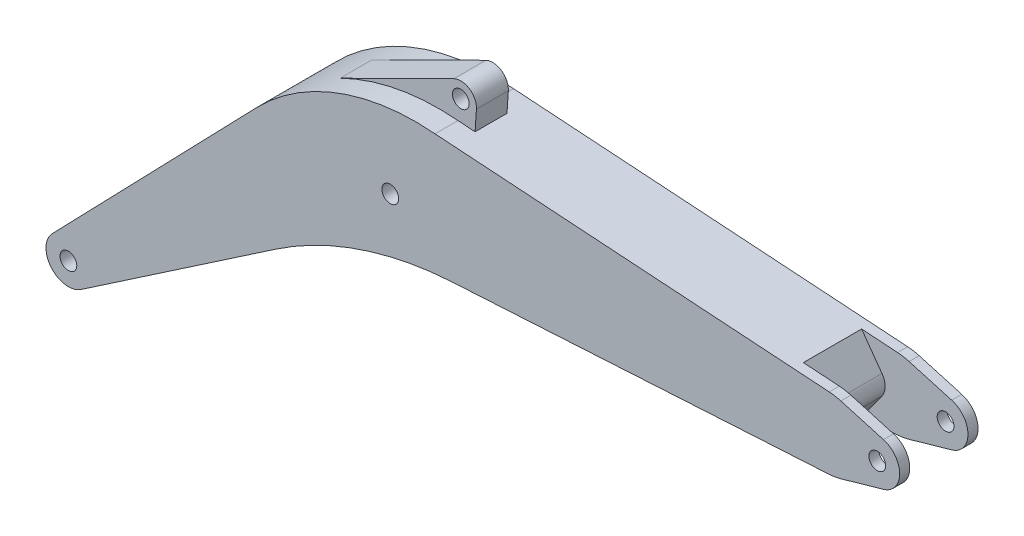
ISO-10303-21;
HEADER;
FILE_DESCRIPTION(('STEP AP214'),'2;1');
FILE_NAME('part.step','',(''),(''),'','','');
FILE_SCHEMA(('AUTOMOTIVE_DESIGN { 1 0 10303 214 1 1 1 1 }'));
ENDSEC;
DATA;
#1=APPLICATION_CONTEXT('core data for automotive mechanical design processes');
#2=APPLICATION_PROTOCOL_DEFINITION('international standard','automotive_design',2000,#1);
#3=PRODUCT_CONTEXT('',#1,'mechanical');
#4=PRODUCT('Part','Part','',(#3));
#5=PRODUCT_RELATED_PRODUCT_CATEGORY('part','',(#4));
#6=PRODUCT_DEFINITION_FORMATION('','',#4);
#7=PRODUCT_DEFINITION_CONTEXT('part definition',#1,'design');
#8=PRODUCT_DEFINITION('design','',#6,#7);
#9=PRODUCT_DEFINITION_SHAPE('','',#8);
#10=(LENGTH_UNIT() NAMED_UNIT(*) SI_UNIT(.MILLI.,.METRE.));
#11=(NAMED_UNIT(*) PLANE_ANGLE_UNIT() SI_UNIT($,.RADIAN.));
#12=(NAMED_UNIT(*) SI_UNIT($,.STERADIAN.) SOLID_ANGLE_UNIT());
#13=UNCERTAINTY_MEASURE_WITH_UNIT(LENGTH_MEASURE(1.E-05),#10,'distance_accuracy_value','');
#14=(GEOMETRIC_REPRESENTATION_CONTEXT(3) GLOBAL_UNCERTAINTY_ASSIGNED_CONTEXT((#13)) GLOBAL_UNIT_ASSIGNED_CONTEXT((#10,
#11,#12)) REPRESENTATION_CONTEXT('',''));
#15=CARTESIAN_POINT('',(0.,0.,0.));
#16=DIRECTION('',(0.,0.,1.));
#17=DIRECTION('',(1.,0.,0.));
#18=AXIS2_PLACEMENT_3D('',#15,#16,#17);
#19=CARTESIAN_POINT('',(279.256107712575,105.107215986189,-10.5002382098289));
#20=DIRECTION('',(0.,0.,1.));
#21=DIRECTION('',(1.,0.,0.));
#22=AXIS2_PLACEMENT_3D('',#19,#20,#21);
#23=CYLINDRICAL_SURFACE('',#22,6.);
#24=CARTESIAN_POINT('',(279.256107712575,105.107215986189,-7.80023820982889));
#25=DIRECTION('',(0.,0.,1.));
#26=DIRECTION('',(1.,0.,0.));
#27=AXIS2_PLACEMENT_3D('',#24,#25,#26);
#28=CIRCLE('',#27,6.00000000000002);
#29=CARTESIAN_POINT('',(280.904961768903,99.3382229803923,-7.80023820982889));
#30=VERTEX_POINT('',#29);
#31=CARTESIAN_POINT('',(280.904961768903,110.876208991986,-7.80023820982889));
#32=VERTEX_POINT('',#31);
#33=EDGE_CURVE('E438',#30,#32,#28,.T.);
#34=ORIENTED_EDGE('',*,*,#33,.F.);
#35=DIRECTION('',(0.,0.,1.));
#36=VECTOR('',#35,1.);
#37=CARTESIAN_POINT('',(280.904961768903,99.3382229803923,-10.5002382098289));
#38=LINE('',#37,#36);
#39=CARTESIAN_POINT('',(280.904961768903,99.3382229803923,-10.5002382098289));
#40=VERTEX_POINT('',#39);
#41=EDGE_CURVE('E282',#40,#30,#38,.T.);
#42=ORIENTED_EDGE('',*,*,#41,.F.);
#43=CARTESIAN_POINT('',(279.256107712575,105.107215986189,-10.5002382098289));
#44=DIRECTION('',(0.,0.,1.));
#45=DIRECTION('',(1.,0.,0.));
#46=AXIS2_PLACEMENT_3D('',#43,#44,#45);
#47=CIRCLE('',#46,6.);
#48=CARTESIAN_POINT('',(280.904961768903,110.876208991986,-10.5002382098289));
#49=VERTEX_POINT('',#48);
#50=EDGE_CURVE('E309',#49,#40,#47,.F.);
#51=ORIENTED_EDGE('',*,*,#50,.F.);
#52=DIRECTION('',(0.,0.,1.));
#53=VECTOR('',#52,1.);
#54=CARTESIAN_POINT('',(280.904961768903,110.876208991986,-10.5002382098289));
#55=LINE('',#54,#53);
#56=EDGE_CURVE('E263',#49,#32,#55,.T.);
#57=ORIENTED_EDGE('',*,*,#56,.T.);
#58=EDGE_LOOP('',(#34,#42,#51,#57));
#59=FACE_BOUND('',#58,.T.);
#60=ADVANCED_FACE('F43',(#59),#23,.T.);
#61=CARTESIAN_POINT('',(-91.7008516265106,-7.15741780321019,-10.5002382098289));
#62=DIRECTION('',(0.274809009388006,-0.96149883429944,0.));
#63=DIRECTION('',(0.961498834299441,0.274809009388006,0.));
#64=AXIS2_PLACEMENT_3D('',#61,#62,#63);
#65=PLANE('',#64);
#66=ORIENTED_EDGE('',*,*,#41,.T.);
#67=DIRECTION('',(0.96149883429944,0.274809009388006,0.));
#68=VECTOR('',#67,1.);
#69=CARTESIAN_POINT('',(-91.7008516265107,-7.1574178032101,-7.80023820982889));
#70=LINE('',#69,#68);
#71=CARTESIAN_POINT('',(269.558454251928,96.0952419392086,-7.80023820982889));
#72=VERTEX_POINT('',#71);
#73=EDGE_CURVE('E439',#72,#30,#70,.T.);
#74=ORIENTED_EDGE('',*,*,#73,.F.);
#75=DIRECTION('',(0.,0.,1.));
#76=VECTOR('',#75,1.);
#77=CARTESIAN_POINT('',(269.558454251928,96.0952419392086,-10.5002382098289));
#78=LINE('',#77,#76);
#79=CARTESIAN_POINT('',(269.558454251928,96.0952419392086,-10.5002382098289));
#80=VERTEX_POINT('',#79);
#81=EDGE_CURVE('E259',#72,#80,#78,.F.);
#82=ORIENTED_EDGE('',*,*,#81,.T.);
#83=DIRECTION('',(0.96149883429944,0.274809009388006,0.));
#84=VECTOR('',#83,1.);
#85=CARTESIAN_POINT('',(-91.7008516265106,-7.15741780321019,-10.5002382098289));
#86=LINE('',#85,#84);
#87=EDGE_CURVE('E290',#80,#40,#86,.T.);
#88=ORIENTED_EDGE('',*,*,#87,.T.);
#89=EDGE_LOOP('',(#66,#74,#82,#88));
#90=FACE_BOUND('',#89,.T.);
#91=ADVANCED_FACE('F479',(#90),#65,.T.);
#92=CARTESIAN_POINT('',(279.256107712575,105.107215986189,-10.5002382098289));
#93=DIRECTION('',(0.,0.,1.));
#94=DIRECTION('',(1.,0.,0.));
#95=AXIS2_PLACEMENT_3D('',#92,#93,#94);
#96=CYLINDRICAL_SURFACE('',#95,2.25);
#97=CARTESIAN_POINT('',(279.256107712575,105.107215986189,-10.5002382098289));
#98=DIRECTION('',(0.,0.,1.));
#99=DIRECTION('',(1.,0.,0.));
#100=AXIS2_PLACEMENT_3D('',#97,#98,#99);
#101=CIRCLE('',#100,2.25);
#102=CARTESIAN_POINT('',(281.506107712575,105.107215986189,-10.5002382098289));
#103=VERTEX_POINT('',#102);
#104=EDGE_CURVE('E312',#103,#103,#101,.T.);
#105=ORIENTED_EDGE('',*,*,#104,.F.);
#106=EDGE_LOOP('',(#105));
#107=FACE_BOUND('',#106,.T.);
#108=CARTESIAN_POINT('',(279.256107712575,105.107215986189,-7.80023820982889));
#109=DIRECTION('',(0.,0.,1.));
#110=DIRECTION('',(1.,0.,0.));
#111=AXIS2_PLACEMENT_3D('',#108,#109,#110);
#112=CIRCLE('',#111,2.25);
#113=CARTESIAN_POINT('',(281.506107712575,105.107215986189,-7.80023820982889));
#114=VERTEX_POINT('',#113);
#115=EDGE_CURVE('E405',#114,#114,#112,.F.);
#116=ORIENTED_EDGE('',*,*,#115,.F.);
#117=EDGE_LOOP('',(#116));
#118=FACE_BOUND('',#117,.T.);
#119=ADVANCED_FACE('F570',(#107,#118),#96,.F.);
#120=CARTESIAN_POINT('',(-11.0054548442672,194.308044328481,-10.5002382098289));
#121=DIRECTION('',(-0.274809009387999,-0.961498834299442,0.));
#122=DIRECTION('',(0.961498834299443,-0.274809009387999,0.));
#123=AXIS2_PLACEMENT_3D('',#120,#121,#122);
#124=PLANE('',#123);
#125=DIRECTION('',(-0.961498834299442,0.274809009387999,0.));
#126=VECTOR('',#125,1.);
#127=CARTESIAN_POINT('',(-11.0054548442669,194.308044328481,-7.80023820982889));
#128=LINE('',#127,#126);
#129=CARTESIAN_POINT('',(269.494876716399,114.137361328791,-7.80023820982889));
#130=VERTEX_POINT('',#129);
#131=EDGE_CURVE('E59',#32,#130,#128,.T.);
#132=ORIENTED_EDGE('',*,*,#131,.F.);
#133=ORIENTED_EDGE('',*,*,#56,.F.);
#134=DIRECTION('',(0.961498834299443,-0.274809009387999,0.));
#135=VECTOR('',#134,1.);
#136=CARTESIAN_POINT('',(-11.0054548442672,194.308044328481,-10.5002382098289));
#137=LINE('',#136,#135);
#138=CARTESIAN_POINT('',(269.494876716399,114.137361328791,-10.5002382098289));
#139=VERTEX_POINT('',#138);
#140=EDGE_CURVE('E308',#139,#49,#137,.T.);
#141=ORIENTED_EDGE('',*,*,#140,.F.);
#142=DIRECTION('',(0.,0.,1.));
#143=VECTOR('',#142,1.);
#144=CARTESIAN_POINT('',(269.494876716399,114.137361328791,-10.5002382098289));
#145=LINE('',#144,#143);
#146=EDGE_CURVE('E244',#139,#130,#145,.T.);
#147=ORIENTED_EDGE('',*,*,#146,.T.);
#148=EDGE_LOOP('',(#132,#133,#141,#147));
#149=FACE_BOUND('',#148,.T.);
#150=ADVANCED_FACE('F488',(#149),#124,.F.);
#151=CARTESIAN_POINT('',(265.436319111108,110.5177244537,-10.5002382098289));
#152=DIRECTION('',(0.,0.,1.));
#153=DIRECTION('',(1.,0.,0.));
#154=AXIS2_PLACEMENT_3D('',#151,#152,#153);
#155=CYLINDRICAL_SURFACE('',#154,15.);
#156=ORIENTED_EDGE('',*,*,#81,.F.);
#157=CARTESIAN_POINT('',(265.436319111108,110.5177244537,-7.80023820982889));
#158=DIRECTION('',(0.,0.,1.));
#159=DIRECTION('',(1.,0.,0.));
#160=AXIS2_PLACEMENT_3D('',#157,#158,#159);
#161=CIRCLE('',#160,15.);
#162=CARTESIAN_POINT('',(266.308529199915,95.5431042728414,-7.80023820982889));
#163=VERTEX_POINT('',#162);
#164=EDGE_CURVE('E445',#163,#72,#161,.T.);
#165=ORIENTED_EDGE('',*,*,#164,.F.);
#166=DIRECTION('',(0.,0.,1.));
#167=VECTOR('',#166,1.);
#168=CARTESIAN_POINT('',(266.308529199915,95.5431042728414,-10.5002382098289));
#169=LINE('',#168,#167);
#170=CARTESIAN_POINT('',(266.308529199915,95.5431042728414,-10.5002382098289));
#171=VERTEX_POINT('',#170);
#172=EDGE_CURVE('E262',#171,#163,#169,.T.);
#173=ORIENTED_EDGE('',*,*,#172,.F.);
#174=CARTESIAN_POINT('',(265.436319111108,110.5177244537,-10.5002382098289));
#175=DIRECTION('',(0.,0.,1.));
#176=DIRECTION('',(1.,0.,0.));
#177=AXIS2_PLACEMENT_3D('',#174,#175,#176);
#178=CIRCLE('',#177,15.);
#179=EDGE_CURVE('E248',#80,#171,#178,.F.);
#180=ORIENTED_EDGE('',*,*,#179,.F.);
#181=EDGE_LOOP('',(#156,#165,#173,#180));
#182=FACE_BOUND('',#181,.T.);
#183=ADVANCED_FACE('F476',(#182),#155,.T.);
#184=CARTESIAN_POINT('',(265.372741575579,99.7148788142994,-10.5002382098289));
#185=DIRECTION('',(0.,0.,1.));
#186=DIRECTION('',(1.,0.,0.));
#187=AXIS2_PLACEMENT_3D('',#184,#185,#186);
#188=CYLINDRICAL_SURFACE('',#187,15.);
#189=DIRECTION('',(0.,0.,1.));
#190=VECTOR('',#189,1.);
#191=CARTESIAN_POINT('',(266.375407776766,114.681329979789,-10.5002382098289));
#192=LINE('',#191,#190);
#193=CARTESIAN_POINT('',(266.375407776766,114.681329979789,-7.80023820982889));
#194=VERTEX_POINT('',#193);
#195=CARTESIAN_POINT('',(266.375407776766,114.681329979789,-10.5002382098289));
#196=VERTEX_POINT('',#195);
#197=EDGE_CURVE('E51',#194,#196,#192,.F.);
#198=ORIENTED_EDGE('',*,*,#197,.F.);
#199=CARTESIAN_POINT('',(265.372741575579,99.7148788142994,-7.80023820982889));
#200=DIRECTION('',(0.,0.,1.));
#201=DIRECTION('',(1.,0.,0.));
#202=AXIS2_PLACEMENT_3D('',#199,#200,#201);
#203=CIRCLE('',#202,15.);
#204=EDGE_CURVE('E225',#130,#194,#203,.T.);
#205=ORIENTED_EDGE('',*,*,#204,.F.);
#206=ORIENTED_EDGE('',*,*,#146,.F.);
#207=CARTESIAN_POINT('',(265.372741575579,99.7148788142994,-10.5002382098289));
#208=DIRECTION('',(0.,0.,1.));
#209=DIRECTION('',(1.,0.,0.));
#210=AXIS2_PLACEMENT_3D('',#207,#208,#209);
#211=CIRCLE('',#210,15.);
#212=EDGE_CURVE('E242',#196,#139,#211,.F.);
#213=ORIENTED_EDGE('',*,*,#212,.F.);
#214=EDGE_LOOP('',(#198,#205,#206,#213));
#215=FACE_BOUND('',#214,.T.);
#216=ADVANCED_FACE('F243',(#215),#188,.T.);
#217=CARTESIAN_POINT('',(155.540273259997,62.6790747288117,-10.5002382098289));
#218=DIRECTION('',(0.,0.,1.));
#219=DIRECTION('',(1.,0.,0.));
#220=AXIS2_PLACEMENT_3D('',#217,#218,#219);
#221=CYLINDRICAL_SURFACE('',#220,59.3079396325931);
#222=CARTESIAN_POINT('',(155.540273259997,62.6790747288117,-4.20023820982889));
#223=DIRECTION('',(0.,0.,1.));
#224=DIRECTION('',(1.,0.,0.));
#225=AXIS2_PLACEMENT_3D('',#222,#223,#224);
#226=CIRCLE('',#225,59.3079396325931);
#227=CARTESIAN_POINT('',(160.756107712574,121.757215986189,-4.20023820982889));
#228=VERTEX_POINT('',#227);
#229=CARTESIAN_POINT('',(129.180390453092,115.807111412558,-4.20023820982889));
#230=VERTEX_POINT('',#229);
#231=EDGE_CURVE('E384',#228,#230,#226,.T.);
#232=ORIENTED_EDGE('',*,*,#231,.F.);
#233=DIRECTION('',(0.,0.,1.));
#234=VECTOR('',#233,1.);
#235=CARTESIAN_POINT('',(160.756107712574,121.757215986189,-10.5002382098289));
#236=LINE('',#235,#234);
#237=CARTESIAN_POINT('',(160.756107712574,121.757215986189,-10.5002382098289));
#238=VERTEX_POINT('',#237);
#239=EDGE_CURVE('E269',#238,#228,#236,.T.);
#240=ORIENTED_EDGE('',*,*,#239,.F.);
#241=CARTESIAN_POINT('',(155.540273259997,62.6790747288117,-10.5002382098289));
#242=DIRECTION('',(0.,0.,1.));
#243=DIRECTION('',(1.,0.,0.));
#244=AXIS2_PLACEMENT_3D('',#241,#242,#243);
#245=CIRCLE('',#244,59.3079396325931);
#246=CARTESIAN_POINT('',(112.906107712575,103.907215986189,-10.5002382098289));
#247=VERTEX_POINT('',#246);
#248=EDGE_CURVE('E302',#247,#238,#245,.F.);
#249=ORIENTED_EDGE('',*,*,#248,.F.);
#250=DIRECTION('',(0.,0.,1.));
#251=VECTOR('',#250,1.);
#252=CARTESIAN_POINT('',(112.906107712575,103.907215986189,-10.5002382098289));
#253=LINE('',#252,#251);
#254=CARTESIAN_POINT('',(112.906107712575,103.907215986189,10.4997617901711));
#255=VERTEX_POINT('',#254);
#256=EDGE_CURVE('E271',#247,#255,#253,.T.);
#257=ORIENTED_EDGE('',*,*,#256,.T.);
#258=CARTESIAN_POINT('',(155.540273259997,62.6790747288117,10.4997617901711));
#259=DIRECTION('',(0.,0.,1.));
#260=DIRECTION('',(1.,0.,0.));
#261=AXIS2_PLACEMENT_3D('',#258,#259,#260);
#262=CIRCLE('',#261,59.3079396325931);
#263=CARTESIAN_POINT('',(160.756107712574,121.757215986189,10.4997617901711));
#264=VERTEX_POINT('',#263);
#265=EDGE_CURVE('E338',#255,#264,#262,.F.);
#266=ORIENTED_EDGE('',*,*,#265,.T.);
#267=CARTESIAN_POINT('',(160.756107712574,121.757215986189,4.34976179017111));
#268=VERTEX_POINT('',#267);
#269=EDGE_CURVE('E268',#268,#264,#236,.T.);
#270=ORIENTED_EDGE('',*,*,#269,.F.);
#271=CARTESIAN_POINT('',(155.540273259997,62.6790747288117,4.34976179017111));
#272=DIRECTION('',(0.,0.,1.));
#273=DIRECTION('',(1.,0.,0.));
#274=AXIS2_PLACEMENT_3D('',#271,#272,#273);
#275=CIRCLE('',#274,59.3079396325931);
#276=CARTESIAN_POINT('',(129.180390453092,115.807111412558,4.34976179017111));
#277=VERTEX_POINT('',#276);
#278=EDGE_CURVE('E67',#268,#277,#275,.T.);
#279=ORIENTED_EDGE('',*,*,#278,.T.);
#280=DIRECTION('',(0.,0.,1.));
#281=VECTOR('',#280,1.);
#282=CARTESIAN_POINT('',(129.180390453092,115.807111412558,-4.20023820982889));
#283=LINE('',#282,#281);
#284=EDGE_CURVE('E363',#230,#277,#283,.T.);
#285=ORIENTED_EDGE('',*,*,#284,.F.);
#286=EDGE_LOOP('',(#232,#240,#249,#257,#266,#270,#279,#285));
#287=FACE_BOUND('',#286,.T.);
#288=ADVANCED_FACE('F492',(#287),#221,.T.);
#289=CARTESIAN_POINT('',(-67.7727257868414,137.067334250886,-10.5002382098289));
#290=DIRECTION('',(-0.0668444134124416,-0.997763411032669,0.));
#291=DIRECTION('',(0.997763411032669,-0.0668444134124416,0.));
#292=AXIS2_PLACEMENT_3D('',#289,#290,#291);
#293=PLANE('',#292);
#294=CARTESIAN_POINT('',(266.375407776766,114.681329979789,10.4997617901711));
#295=VERTEX_POINT('',#294);
#296=CARTESIAN_POINT('',(266.375407776766,114.681329979789,7.79976179017111));
#297=VERTEX_POINT('',#296);
#298=EDGE_CURVE('E12',#295,#297,#192,.F.);
#299=ORIENTED_EDGE('',*,*,#298,.T.);
#300=DIRECTION('',(-0.997763411032669,0.0668444134124416,0.));
#301=VECTOR('',#300,1.);
#302=CARTESIAN_POINT('',(-67.7727257868414,137.067334250886,7.79976179017111));
#303=LINE('',#302,#301);
#304=CARTESIAN_POINT('',(256.756107712575,115.325767792521,7.79976179017111));
#305=VERTEX_POINT('',#304);
#306=EDGE_CURVE('E427',#297,#305,#303,.T.);
#307=ORIENTED_EDGE('',*,*,#306,.T.);
#308=DIRECTION('',(0.,0.,-1.));
#309=VECTOR('',#308,1.);
#310=CARTESIAN_POINT('',(256.756107712575,115.325767792521,7.79976179017111));
#311=LINE('',#310,#309);
#312=CARTESIAN_POINT('',(256.756107712575,115.325767792521,-7.80023820982889));
#313=VERTEX_POINT('',#312);
#314=EDGE_CURVE('E237',#305,#313,#311,.T.);
#315=ORIENTED_EDGE('',*,*,#314,.T.);
#316=DIRECTION('',(-0.997763411032669,0.0668444134124416,0.));
#317=VECTOR('',#316,1.);
#318=CARTESIAN_POINT('',(-67.7727257868414,137.067334250886,-7.80023820982889));
#319=LINE('',#318,#317);
#320=EDGE_CURVE('E227',#194,#313,#319,.T.);
#321=ORIENTED_EDGE('',*,*,#320,.F.);
#322=ORIENTED_EDGE('',*,*,#197,.T.);
#323=DIRECTION('',(0.997763411032669,-0.0668444134124416,0.));
#324=VECTOR('',#323,1.);
#325=CARTESIAN_POINT('',(-67.7727257868414,137.067334250886,-10.5002382098289));
#326=LINE('',#325,#324);
#327=EDGE_CURVE('E306',#238,#196,#326,.T.);
#328=ORIENTED_EDGE('',*,*,#327,.F.);
#329=ORIENTED_EDGE('',*,*,#239,.T.);
#330=DIRECTION('',(-0.997763411032669,0.0668444134124416,0.));
#331=VECTOR('',#330,1.);
#332=CARTESIAN_POINT('',(-67.7727257868414,137.067334250886,-4.20023820982889));
#333=LINE('',#332,#331);
#334=CARTESIAN_POINT('',(165.33321039356,121.45057641567,-4.20023820982889));
#335=VERTEX_POINT('',#334);
#336=EDGE_CURVE('E382',#335,#228,#333,.T.);
#337=ORIENTED_EDGE('',*,*,#336,.F.);
#338=DIRECTION('',(0.,0.,1.));
#339=VECTOR('',#338,1.);
#340=CARTESIAN_POINT('',(165.33321039356,121.45057641567,-4.20023820982889));
#341=LINE('',#340,#339);
#342=CARTESIAN_POINT('',(165.33321039356,121.45057641567,4.34976179017111));
#343=VERTEX_POINT('',#342);
#344=EDGE_CURVE('E365',#335,#343,#341,.T.);
#345=ORIENTED_EDGE('',*,*,#344,.T.);
#346=DIRECTION('',(-0.997763411032669,0.0668444134124416,0.));
#347=VECTOR('',#346,1.);
#348=CARTESIAN_POINT('',(-67.7727257868414,137.067334250886,4.34976179017111));
#349=LINE('',#348,#347);
#350=EDGE_CURVE('E396',#343,#268,#349,.T.);
#351=ORIENTED_EDGE('',*,*,#350,.T.);
#352=ORIENTED_EDGE('',*,*,#269,.T.);
#353=DIRECTION('',(0.997763411032669,-0.0668444134124416,0.));
#354=VECTOR('',#353,1.);
#355=CARTESIAN_POINT('',(-67.7727257868414,137.067334250886,10.4997617901711));
#356=LINE('',#355,#354);
#357=EDGE_CURVE('E345',#264,#295,#356,.T.);
#358=ORIENTED_EDGE('',*,*,#357,.T.);
#359=EDGE_LOOP('',(#299,#307,#315,#321,#322,#328,#329,#337,#345,#351,#352,#358));
#360=FACE_BOUND('',#359,.T.);
#361=ADVANCED_FACE('F232',(#360),#293,.F.);
#362=CARTESIAN_POINT('',(280.904961768903,99.3382229803923,7.79976179017111));
#363=VERTEX_POINT('',#362);
#364=CARTESIAN_POINT('',(280.904961768903,99.3382229803923,10.4997617901711));
#365=VERTEX_POINT('',#364);
#366=EDGE_CURVE('E283',#363,#365,#38,.T.);
#367=ORIENTED_EDGE('',*,*,#366,.F.);
#368=CARTESIAN_POINT('',(279.256107712575,105.107215986189,7.79976179017111));
#369=DIRECTION('',(0.,0.,1.));
#370=DIRECTION('',(1.,0.,0.));
#371=AXIS2_PLACEMENT_3D('',#368,#369,#370);
#372=CIRCLE('',#371,6.00000000000002);
#373=CARTESIAN_POINT('',(280.904961768903,110.876208991986,7.79976179017111));
#374=VERTEX_POINT('',#373);
#375=EDGE_CURVE('E415',#363,#374,#372,.T.);
#376=ORIENTED_EDGE('',*,*,#375,.T.);
#377=CARTESIAN_POINT('',(280.904961768903,110.876208991986,10.4997617901711));
#378=VERTEX_POINT('',#377);
#379=EDGE_CURVE('E267',#374,#378,#55,.T.);
#380=ORIENTED_EDGE('',*,*,#379,.T.);
#381=CARTESIAN_POINT('',(279.256107712575,105.107215986189,10.4997617901711));
#382=DIRECTION('',(0.,0.,1.));
#383=DIRECTION('',(1.,0.,0.));
#384=AXIS2_PLACEMENT_3D('',#381,#382,#383);
#385=CIRCLE('',#384,6.);
#386=EDGE_CURVE('E347',#378,#365,#385,.F.);
#387=ORIENTED_EDGE('',*,*,#386,.T.);
#388=EDGE_LOOP('',(#367,#376,#380,#387));
#389=FACE_BOUND('',#388,.T.);
#390=ADVANCED_FACE('F535',(#389),#23,.T.);
#391=DIRECTION('',(0.96149883429944,0.274809009388006,0.));
#392=VECTOR('',#391,1.);
#393=CARTESIAN_POINT('',(-91.7008516265107,-7.1574178032101,7.79976179017111));
#394=LINE('',#393,#392);
#395=CARTESIAN_POINT('',(269.558454251928,96.0952419392086,7.79976179017111));
#396=VERTEX_POINT('',#395);
#397=EDGE_CURVE('E414',#396,#363,#394,.T.);
#398=ORIENTED_EDGE('',*,*,#397,.T.);
#399=ORIENTED_EDGE('',*,*,#366,.T.);
#400=DIRECTION('',(0.96149883429944,0.274809009388006,0.));
#401=VECTOR('',#400,1.);
#402=CARTESIAN_POINT('',(-91.7008516265106,-7.15741780321019,10.4997617901711));
#403=LINE('',#402,#401);
#404=CARTESIAN_POINT('',(269.558454251928,96.0952419392086,10.4997617901711));
#405=VERTEX_POINT('',#404);
#406=EDGE_CURVE('E321',#405,#365,#403,.T.);
#407=ORIENTED_EDGE('',*,*,#406,.F.);
#408=EDGE_CURVE('E254',#405,#396,#78,.F.);
#409=ORIENTED_EDGE('',*,*,#408,.T.);
#410=EDGE_LOOP('',(#398,#399,#407,#409));
#411=FACE_BOUND('',#410,.T.);
#412=ADVANCED_FACE('F534',(#411),#65,.T.);
#413=CARTESIAN_POINT('',(-87.2813861685911,74.9479447455989,-10.5002382098289));
#414=DIRECTION('',(0.0581473392537677,-0.998308012057254,0.));
#415=DIRECTION('',(0.998308012057255,0.0581473392537677,0.));
#416=AXIS2_PLACEMENT_3D('',#413,#414,#415);
#417=PLANE('',#416);
#418=DIRECTION('',(0.998308012057255,0.0581473392537677,0.));
#419=VECTOR('',#418,1.);
#420=CARTESIAN_POINT('',(-87.2813861685911,74.9479447455989,7.79976179017111));
#421=LINE('',#420,#419);
#422=CARTESIAN_POINT('',(256.756107712575,94.9867149759402,7.79976179017111));
#423=VERTEX_POINT('',#422);
#424=CARTESIAN_POINT('',(266.308529199915,95.5431042728414,7.79976179017111));
#425=VERTEX_POINT('',#424);
#426=EDGE_CURVE('E423',#423,#425,#421,.T.);
#427=ORIENTED_EDGE('',*,*,#426,.T.);
#428=CARTESIAN_POINT('',(266.308529199915,95.5431042728414,10.4997617901711));
#429=VERTEX_POINT('',#428);
#430=EDGE_CURVE('E261',#425,#429,#169,.T.);
#431=ORIENTED_EDGE('',*,*,#430,.T.);
#432=DIRECTION('',(0.998308012057255,0.0581473392537677,0.));
#433=VECTOR('',#432,1.);
#434=CARTESIAN_POINT('',(-87.2813861685911,74.9479447455989,10.4997617901711));
#435=LINE('',#434,#433);
#436=CARTESIAN_POINT('',(165.256107712574,89.6572159861889,10.4997617901711));
#437=VERTEX_POINT('',#436);
#438=EDGE_CURVE('E322',#437,#429,#435,.T.);
#439=ORIENTED_EDGE('',*,*,#438,.F.);
#440=DIRECTION('',(0.,0.,1.));
#441=VECTOR('',#440,1.);
#442=CARTESIAN_POINT('',(165.256107712574,89.6572159861889,-10.5002382098289));
#443=LINE('',#442,#441);
#444=CARTESIAN_POINT('',(165.256107712574,89.6572159861889,-10.5002382098289));
#445=VERTEX_POINT('',#444);
#446=EDGE_CURVE('E281',#445,#437,#443,.T.);
#447=ORIENTED_EDGE('',*,*,#446,.F.);
#448=DIRECTION('',(0.998308012057255,0.0581473392537677,0.));
#449=VECTOR('',#448,1.);
#450=CARTESIAN_POINT('',(-87.2813861685911,74.9479447455989,-10.5002382098289));
#451=LINE('',#450,#449);
#452=EDGE_CURVE('E289',#445,#171,#451,.T.);
#453=ORIENTED_EDGE('',*,*,#452,.T.);
#454=ORIENTED_EDGE('',*,*,#172,.T.);
#455=DIRECTION('',(0.998308012057255,0.0581473392537677,0.));
#456=VECTOR('',#455,1.);
#457=CARTESIAN_POINT('',(-87.2813861685911,74.9479447455989,-7.80023820982889));
#458=LINE('',#457,#456);
#459=CARTESIAN_POINT('',(256.756107712575,94.9867149759402,-7.80023820982889));
#460=VERTEX_POINT('',#459);
#461=EDGE_CURVE('E443',#460,#163,#458,.T.);
#462=ORIENTED_EDGE('',*,*,#461,.F.);
#463=DIRECTION('',(0.,0.,-1.));
#464=VECTOR('',#463,1.);
#465=CARTESIAN_POINT('',(256.756107712575,94.9867149759402,7.79976179017111));
#466=LINE('',#465,#464);
#467=EDGE_CURVE('E407',#423,#460,#466,.T.);
#468=ORIENTED_EDGE('',*,*,#467,.F.);
#469=EDGE_LOOP('',(#427,#431,#439,#447,#453,#454,#462,#468));
#470=FACE_BOUND('',#469,.T.);
#471=ADVANCED_FACE('F468',(#470),#417,.T.);
#472=CARTESIAN_POINT('',(170.709678505641,-3.97292232984775,-10.5002382098289));
#473=DIRECTION('',(0.,0.,1.));
#474=DIRECTION('',(1.,0.,0.));
#475=AXIS2_PLACEMENT_3D('',#472,#473,#474);
#476=CYLINDRICAL_SURFACE('',#475,93.7888278819772);
#477=ORIENTED_EDGE('',*,*,#446,.T.);
#478=CARTESIAN_POINT('',(170.709678505641,-3.97292232984775,10.4997617901711));
#479=DIRECTION('',(0.,0.,1.));
#480=DIRECTION('',(1.,0.,0.));
#481=AXIS2_PLACEMENT_3D('',#478,#479,#480);
#482=CIRCLE('',#481,93.7888278819772);
#483=CARTESIAN_POINT('',(118.006107712575,73.6072159861889,10.4997617901711));
#484=VERTEX_POINT('',#483);
#485=EDGE_CURVE('E329',#484,#437,#482,.F.);
#486=ORIENTED_EDGE('',*,*,#485,.F.);
#487=DIRECTION('',(0.,0.,1.));
#488=VECTOR('',#487,1.);
#489=CARTESIAN_POINT('',(118.006107712575,73.6072159861889,-10.5002382098289));
#490=LINE('',#489,#488);
#491=CARTESIAN_POINT('',(118.006107712575,73.6072159861889,-10.5002382098289));
#492=VERTEX_POINT('',#491);
#493=EDGE_CURVE('E278',#492,#484,#490,.T.);
#494=ORIENTED_EDGE('',*,*,#493,.F.);
#495=CARTESIAN_POINT('',(170.709678505641,-3.97292232984775,-10.5002382098289));
#496=DIRECTION('',(0.,0.,1.));
#497=DIRECTION('',(1.,0.,0.));
#498=AXIS2_PLACEMENT_3D('',#495,#496,#497);
#499=CIRCLE('',#498,93.7888278819772);
#500=EDGE_CURVE('E292',#492,#445,#499,.F.);
#501=ORIENTED_EDGE('',*,*,#500,.T.);
#502=EDGE_LOOP('',(#477,#486,#494,#501));
#503=FACE_BOUND('',#502,.T.);
#504=ADVANCED_FACE('F547',(#503),#476,.F.);
#505=CARTESIAN_POINT('',(-73.9097053561091,-56.7695642042564,-10.5002382098289));
#506=DIRECTION('',(0.561938686976534,-0.827178887592696,0.));
#507=DIRECTION('',(0.827178887592696,0.561938686976534,0.));
#508=AXIS2_PLACEMENT_3D('',#505,#506,#507);
#509=PLANE('',#508);
#510=ORIENTED_EDGE('',*,*,#493,.T.);
#511=DIRECTION('',(0.827178887592696,0.561938686976534,0.));
#512=VECTOR('',#511,1.);
#513=CARTESIAN_POINT('',(-73.9097053561091,-56.7695642042564,10.4997617901711));
#514=LINE('',#513,#512);
#515=CARTESIAN_POINT('',(65.8777398344338,38.1941426606327,10.4997617901711));
#516=VERTEX_POINT('',#515);
#517=EDGE_CURVE('E331',#516,#484,#514,.T.);
#518=ORIENTED_EDGE('',*,*,#517,.F.);
#519=DIRECTION('',(0.,0.,1.));
#520=VECTOR('',#519,1.);
#521=CARTESIAN_POINT('',(65.8777398344338,38.1941426606327,-10.5002382098289));
#522=LINE('',#521,#520);
#523=CARTESIAN_POINT('',(65.8777398344338,38.1941426606327,-10.5002382098289));
#524=VERTEX_POINT('',#523);
#525=EDGE_CURVE('E276',#524,#516,#522,.T.);
#526=ORIENTED_EDGE('',*,*,#525,.F.);
#527=DIRECTION('',(0.827178887592696,0.561938686976534,0.));
#528=VECTOR('',#527,1.);
#529=CARTESIAN_POINT('',(-73.9097053561091,-56.7695642042564,-10.5002382098289));
#530=LINE('',#529,#528);
#531=EDGE_CURVE('E294',#524,#492,#530,.T.);
#532=ORIENTED_EDGE('',*,*,#531,.T.);
#533=EDGE_LOOP('',(#510,#518,#526,#532));
#534=FACE_BOUND('',#533,.T.);
#535=ADVANCED_FACE('F553',(#534),#509,.T.);
#536=CARTESIAN_POINT('',(62.5061077125746,43.1572159861889,-10.5002382098289));
#537=DIRECTION('',(0.,0.,1.));
#538=DIRECTION('',(1.,0.,0.));
#539=AXIS2_PLACEMENT_3D('',#536,#537,#538);
#540=CYLINDRICAL_SURFACE('',#539,6.00000000000002);
#541=ORIENTED_EDGE('',*,*,#525,.T.);
#542=CARTESIAN_POINT('',(62.5061077125746,43.1572159861889,10.4997617901711));
#543=DIRECTION('',(0.,0.,1.));
#544=DIRECTION('',(1.,0.,0.));
#545=AXIS2_PLACEMENT_3D('',#542,#543,#544);
#546=CIRCLE('',#545,6.00000000000002);
#547=CARTESIAN_POINT('',(58.1929416361736,47.3281389532771,10.4997617901711));
#548=VERTEX_POINT('',#547);
#549=EDGE_CURVE('E332',#548,#516,#546,.T.);
#550=ORIENTED_EDGE('',*,*,#549,.F.);
#551=DIRECTION('',(0.,0.,1.));
#552=VECTOR('',#551,1.);
#553=CARTESIAN_POINT('',(58.1929416361736,47.3281389532771,-10.5002382098289));
#554=LINE('',#553,#552);
#555=CARTESIAN_POINT('',(58.1929416361736,47.3281389532771,-10.5002382098289));
#556=VERTEX_POINT('',#555);
#557=EDGE_CURVE('E273',#556,#548,#554,.T.);
#558=ORIENTED_EDGE('',*,*,#557,.F.);
#559=CARTESIAN_POINT('',(62.5061077125746,43.1572159861889,-10.5002382098289));
#560=DIRECTION('',(0.,0.,1.));
#561=DIRECTION('',(1.,0.,0.));
#562=AXIS2_PLACEMENT_3D('',#559,#560,#561);
#563=CIRCLE('',#562,6.00000000000002);
#564=EDGE_CURVE('E296',#556,#524,#563,.T.);
#565=ORIENTED_EDGE('',*,*,#564,.T.);
#566=EDGE_LOOP('',(#541,#550,#558,#565));
#567=FACE_BOUND('',#566,.T.);
#568=ADVANCED_FACE('F555',(#567),#540,.T.);
#569=CARTESIAN_POINT('',(-56.0905773742957,-70.8528490863556,-10.5002382098289));
#570=DIRECTION('',(-0.718861012733494,0.695153827848035,0.));
#571=DIRECTION('',(-0.695153827848035,-0.718861012733494,0.));
#572=AXIS2_PLACEMENT_3D('',#569,#570,#571);
#573=PLANE('',#572);
#574=ORIENTED_EDGE('',*,*,#557,.T.);
#575=DIRECTION('',(-0.695153827848035,-0.718861012733494,0.));
#576=VECTOR('',#575,1.);
#577=CARTESIAN_POINT('',(-56.0905773742957,-70.8528490863556,10.4997617901711));
#578=LINE('',#577,#576);
#579=EDGE_CURVE('E340',#255,#548,#578,.T.);
#580=ORIENTED_EDGE('',*,*,#579,.F.);
#581=ORIENTED_EDGE('',*,*,#256,.F.);
#582=DIRECTION('',(-0.695153827848035,-0.718861012733494,0.));
#583=VECTOR('',#582,1.);
#584=CARTESIAN_POINT('',(-56.0905773742957,-70.8528490863556,-10.5002382098289));
#585=LINE('',#584,#583);
#586=EDGE_CURVE('E301',#247,#556,#585,.T.);
#587=ORIENTED_EDGE('',*,*,#586,.T.);
#588=EDGE_LOOP('',(#574,#580,#581,#587));
#589=FACE_BOUND('',#588,.T.);
#590=ADVANCED_FACE('F558',(#589),#573,.T.);
#591=CARTESIAN_POINT('',(279.256107712575,105.107215986189,7.79976179017111));
#592=DIRECTION('',(0.,0.,1.));
#593=DIRECTION('',(1.,0.,0.));
#594=AXIS2_PLACEMENT_3D('',#591,#592,#593);
#595=CIRCLE('',#594,2.25);
#596=CARTESIAN_POINT('',(281.506107712575,105.107215986189,7.79976179017111));
#597=VERTEX_POINT('',#596);
#598=EDGE_CURVE('E397',#597,#597,#595,.F.);
#599=ORIENTED_EDGE('',*,*,#598,.T.);
#600=EDGE_LOOP('',(#599));
#601=FACE_BOUND('',#600,.T.);
#602=CARTESIAN_POINT('',(279.256107712575,105.107215986189,10.4997617901711));
#603=DIRECTION('',(0.,0.,1.));
#604=DIRECTION('',(1.,0.,0.));
#605=AXIS2_PLACEMENT_3D('',#602,#603,#604);
#606=CIRCLE('',#605,2.25);
#607=CARTESIAN_POINT('',(281.506107712575,105.107215986189,10.4997617901711));
#608=VERTEX_POINT('',#607);
#609=EDGE_CURVE('E355',#608,#608,#606,.T.);
#610=ORIENTED_EDGE('',*,*,#609,.T.);
#611=EDGE_LOOP('',(#610));
#612=FACE_BOUND('',#611,.T.);
#613=ADVANCED_FACE('F556',(#601,#612),#96,.F.);
#614=CARTESIAN_POINT('',(148.756107712575,101.811924946996,-10.5002382098289));
#615=DIRECTION('',(0.,0.,1.));
#616=DIRECTION('',(1.,0.,0.));
#617=AXIS2_PLACEMENT_3D('',#614,#615,#616);
#618=CYLINDRICAL_SURFACE('',#617,2.25);
#619=CARTESIAN_POINT('',(148.756107712575,101.811924946996,-10.5002382098289));
#620=DIRECTION('',(0.,0.,1.));
#621=DIRECTION('',(1.,0.,0.));
#622=AXIS2_PLACEMENT_3D('',#619,#620,#621);
#623=CIRCLE('',#622,2.25);
#624=CARTESIAN_POINT('',(151.006107712575,101.811924946996,-10.5002382098289));
#625=VERTEX_POINT('',#624);
#626=EDGE_CURVE('E317',#625,#625,#623,.T.);
#627=ORIENTED_EDGE('',*,*,#626,.F.);
#628=EDGE_LOOP('',(#627));
#629=FACE_BOUND('',#628,.T.);
#630=CARTESIAN_POINT('',(148.756107712575,101.811924946996,10.4997617901711));
#631=DIRECTION('',(0.,0.,1.));
#632=DIRECTION('',(1.,0.,0.));
#633=AXIS2_PLACEMENT_3D('',#630,#631,#632);
#634=CIRCLE('',#633,2.25);
#635=CARTESIAN_POINT('',(151.006107712575,101.811924946996,10.4997617901711));
#636=VERTEX_POINT('',#635);
#637=EDGE_CURVE('E351',#636,#636,#634,.T.);
#638=ORIENTED_EDGE('',*,*,#637,.T.);
#639=EDGE_LOOP('',(#638));
#640=FACE_BOUND('',#639,.T.);
#641=ADVANCED_FACE('F562',(#629,#640),#618,.F.);
#642=CARTESIAN_POINT('',(62.5061077125746,43.1572159861889,-10.5002382098289));
#643=DIRECTION('',(0.,0.,1.));
#644=DIRECTION('',(1.,0.,0.));
#645=AXIS2_PLACEMENT_3D('',#642,#643,#644);
#646=CYLINDRICAL_SURFACE('',#645,2.25);
#647=CARTESIAN_POINT('',(62.5061077125746,43.1572159861889,-10.5002382098289));
#648=DIRECTION('',(0.,0.,1.));
#649=DIRECTION('',(1.,0.,0.));
#650=AXIS2_PLACEMENT_3D('',#647,#648,#649);
#651=CIRCLE('',#650,2.25);
#652=CARTESIAN_POINT('',(64.7561077125746,43.1572159861889,-10.5002382098289));
#653=VERTEX_POINT('',#652);
#654=EDGE_CURVE('E316',#653,#653,#651,.T.);
#655=ORIENTED_EDGE('',*,*,#654,.F.);
#656=EDGE_LOOP('',(#655));
#657=FACE_BOUND('',#656,.T.);
#658=CARTESIAN_POINT('',(62.5061077125746,43.1572159861889,10.4997617901711));
#659=DIRECTION('',(0.,0.,1.));
#660=DIRECTION('',(1.,0.,0.));
#661=AXIS2_PLACEMENT_3D('',#658,#659,#660);
#662=CIRCLE('',#661,2.25);
#663=CARTESIAN_POINT('',(64.7561077125746,43.1572159861889,10.4997617901711));
#664=VERTEX_POINT('',#663);
#665=EDGE_CURVE('E356',#664,#664,#662,.T.);
#666=ORIENTED_EDGE('',*,*,#665,.T.);
#667=EDGE_LOOP('',(#666));
#668=FACE_BOUND('',#667,.T.);
#669=ADVANCED_FACE('F590',(#657,#668),#646,.F.);
#670=ORIENTED_EDGE('',*,*,#379,.F.);
#671=DIRECTION('',(-0.961498834299442,0.274809009387999,0.));
#672=VECTOR('',#671,1.);
#673=CARTESIAN_POINT('',(-11.0054548442669,194.308044328481,7.79976179017111));
#674=LINE('',#673,#672);
#675=CARTESIAN_POINT('',(269.494876716399,114.137361328791,7.79976179017111));
#676=VERTEX_POINT('',#675);
#677=EDGE_CURVE('E434',#374,#676,#674,.T.);
#678=ORIENTED_EDGE('',*,*,#677,.T.);
#679=CARTESIAN_POINT('',(269.494876716399,114.137361328791,10.4997617901711));
#680=VERTEX_POINT('',#679);
#681=EDGE_CURVE('E246',#676,#680,#145,.T.);
#682=ORIENTED_EDGE('',*,*,#681,.T.);
#683=DIRECTION('',(0.961498834299443,-0.274809009387999,0.));
#684=VECTOR('',#683,1.);
#685=CARTESIAN_POINT('',(-11.0054548442672,194.308044328481,10.4997617901711));
#686=LINE('',#685,#684);
#687=EDGE_CURVE('E346',#680,#378,#686,.T.);
#688=ORIENTED_EDGE('',*,*,#687,.T.);
#689=EDGE_LOOP('',(#670,#678,#682,#688));
#690=FACE_BOUND('',#689,.T.);
#691=ADVANCED_FACE('F528',(#690),#124,.F.);
#692=CARTESIAN_POINT('',(-80.1438922874254,-47.5927840138111,-10.5002382098289));
#693=DIRECTION('',(0.,0.,1.));
#694=DIRECTION('',(1.,0.,0.));
#695=AXIS2_PLACEMENT_3D('',#692,#693,#694);
#696=PLANE('',#695);
#697=ORIENTED_EDGE('',*,*,#654,.T.);
#698=EDGE_LOOP('',(#697));
#699=FACE_BOUND('',#698,.T.);
#700=ORIENTED_EDGE('',*,*,#626,.T.);
#701=EDGE_LOOP('',(#700));
#702=FACE_BOUND('',#701,.T.);
#703=ORIENTED_EDGE('',*,*,#104,.T.);
#704=EDGE_LOOP('',(#703));
#705=FACE_BOUND('',#704,.T.);
#706=ORIENTED_EDGE('',*,*,#87,.F.);
#707=ORIENTED_EDGE('',*,*,#179,.T.);
#708=ORIENTED_EDGE('',*,*,#452,.F.);
#709=ORIENTED_EDGE('',*,*,#500,.F.);
#710=ORIENTED_EDGE('',*,*,#531,.F.);
#711=ORIENTED_EDGE('',*,*,#564,.F.);
#712=ORIENTED_EDGE('',*,*,#586,.F.);
#713=ORIENTED_EDGE('',*,*,#248,.T.);
#714=ORIENTED_EDGE('',*,*,#327,.T.);
#715=ORIENTED_EDGE('',*,*,#212,.T.);
#716=ORIENTED_EDGE('',*,*,#140,.T.);
#717=ORIENTED_EDGE('',*,*,#50,.T.);
#718=EDGE_LOOP('',(#706,#707,#708,#709,#710,#711,#712,#713,#714,#715,#716,#717));
#719=FACE_BOUND('',#718,.T.);
#720=ADVANCED_FACE('F486',(#699,#702,#705,#719),#696,.F.);
#721=CARTESIAN_POINT('',(-80.1438922874254,-47.5927840138111,10.4997617901711));
#722=DIRECTION('',(0.,0.,1.));
#723=DIRECTION('',(1.,0.,0.));
#724=AXIS2_PLACEMENT_3D('',#721,#722,#723);
#725=PLANE('',#724);
#726=ORIENTED_EDGE('',*,*,#665,.F.);
#727=EDGE_LOOP('',(#726));
#728=FACE_BOUND('',#727,.T.);
#729=ORIENTED_EDGE('',*,*,#637,.F.);
#730=EDGE_LOOP('',(#729));
#731=FACE_BOUND('',#730,.T.);
#732=ORIENTED_EDGE('',*,*,#609,.F.);
#733=EDGE_LOOP('',(#732));
#734=FACE_BOUND('',#733,.T.);
#735=ORIENTED_EDGE('',*,*,#438,.T.);
#736=CARTESIAN_POINT('',(265.436319111108,110.5177244537,10.4997617901711));
#737=DIRECTION('',(0.,0.,1.));
#738=DIRECTION('',(1.,0.,0.));
#739=AXIS2_PLACEMENT_3D('',#736,#737,#738);
#740=CIRCLE('',#739,15.);
#741=EDGE_CURVE('E256',#429,#405,#740,.T.);
#742=ORIENTED_EDGE('',*,*,#741,.T.);
#743=ORIENTED_EDGE('',*,*,#406,.T.);
#744=ORIENTED_EDGE('',*,*,#386,.F.);
#745=ORIENTED_EDGE('',*,*,#687,.F.);
#746=CARTESIAN_POINT('',(265.372741575579,99.7148788142994,10.4997617901711));
#747=DIRECTION('',(0.,0.,1.));
#748=DIRECTION('',(1.,0.,0.));
#749=AXIS2_PLACEMENT_3D('',#746,#747,#748);
#750=CIRCLE('',#749,15.);
#751=EDGE_CURVE('E258',#680,#295,#750,.T.);
#752=ORIENTED_EDGE('',*,*,#751,.T.);
#753=ORIENTED_EDGE('',*,*,#357,.F.);
#754=ORIENTED_EDGE('',*,*,#265,.F.);
#755=ORIENTED_EDGE('',*,*,#579,.T.);
#756=ORIENTED_EDGE('',*,*,#549,.T.);
#757=ORIENTED_EDGE('',*,*,#517,.T.);
#758=ORIENTED_EDGE('',*,*,#485,.T.);
#759=EDGE_LOOP('',(#735,#742,#743,#744,#745,#752,#753,#754,#755,#756,#757,#758));
#760=FACE_BOUND('',#759,.T.);
#761=ADVANCED_FACE('F516',(#728,#731,#734,#760),#725,.T.);
#762=CARTESIAN_POINT('',(265.436319111108,110.5177244537,7.79976179017111));
#763=DIRECTION('',(0.,0.,1.));
#764=DIRECTION('',(1.,0.,0.));
#765=AXIS2_PLACEMENT_3D('',#762,#763,#764);
#766=CIRCLE('',#765,15.);
#767=EDGE_CURVE('E418',#425,#396,#766,.T.);
#768=ORIENTED_EDGE('',*,*,#767,.T.);
#769=ORIENTED_EDGE('',*,*,#408,.F.);
#770=ORIENTED_EDGE('',*,*,#741,.F.);
#771=ORIENTED_EDGE('',*,*,#430,.F.);
#772=EDGE_LOOP('',(#768,#769,#770,#771));
#773=FACE_BOUND('',#772,.T.);
#774=ADVANCED_FACE('F538',(#773),#155,.T.);
#775=CARTESIAN_POINT('',(265.372741575579,99.7148788142994,7.79976179017111));
#776=DIRECTION('',(0.,0.,1.));
#777=DIRECTION('',(1.,0.,0.));
#778=AXIS2_PLACEMENT_3D('',#775,#776,#777);
#779=CIRCLE('',#778,15.);
#780=EDGE_CURVE('E435',#676,#297,#779,.T.);
#781=ORIENTED_EDGE('',*,*,#780,.T.);
#782=ORIENTED_EDGE('',*,*,#298,.F.);
#783=ORIENTED_EDGE('',*,*,#751,.F.);
#784=ORIENTED_EDGE('',*,*,#681,.F.);
#785=EDGE_LOOP('',(#781,#782,#783,#784));
#786=FACE_BOUND('',#785,.T.);
#787=ADVANCED_FACE('F44',(#786),#188,.T.);
#788=CARTESIAN_POINT('',(-103.850277243088,0.187158666114812,-4.20023820982889));
#789=DIRECTION('',(-0.444457908506042,0.895799736306299,0.));
#790=DIRECTION('',(-0.895799736306299,-0.444457908506042,0.));
#791=AXIS2_PLACEMENT_3D('',#788,#789,#790);
#792=PLANE('',#791);
#793=ORIENTED_EDGE('',*,*,#284,.T.);
#794=DIRECTION('',(-0.895799736306299,-0.444457908506042,0.));
#795=VECTOR('',#794,1.);
#796=CARTESIAN_POINT('',(-103.850277243088,0.187158666114812,4.34976179017111));
#797=LINE('',#796,#795);
#798=CARTESIAN_POINT('',(159.639384496849,130.919574878675,4.34976179017111));
#799=VERTEX_POINT('',#798);
#800=EDGE_CURVE('E390',#799,#277,#797,.T.);
#801=ORIENTED_EDGE('',*,*,#800,.F.);
#802=DIRECTION('',(0.,0.,1.));
#803=VECTOR('',#802,1.);
#804=CARTESIAN_POINT('',(159.639384496849,130.919574878675,-4.20023820982889));
#805=LINE('',#804,#803);
#806=CARTESIAN_POINT('',(159.639384496849,130.919574878675,-4.20023820982889));
#807=VERTEX_POINT('',#806);
#808=EDGE_CURVE('E368',#807,#799,#805,.T.);
#809=ORIENTED_EDGE('',*,*,#808,.F.);
#810=DIRECTION('',(-0.895799736306299,-0.444457908506042,0.));
#811=VECTOR('',#810,1.);
#812=CARTESIAN_POINT('',(-103.850277243088,0.187158666114812,-4.20023820982889));
#813=LINE('',#812,#811);
#814=EDGE_CURVE('E373',#807,#230,#813,.T.);
#815=ORIENTED_EDGE('',*,*,#814,.T.);
#816=EDGE_LOOP('',(#793,#801,#809,#815));
#817=FACE_BOUND('',#816,.T.);
#818=ADVANCED_FACE('F503',(#817),#792,.T.);
#819=CARTESIAN_POINT('',(161.506107712575,127.157215986189,-4.20023820982889));
#820=DIRECTION('',(0.,0.,1.));
#821=DIRECTION('',(1.,0.,0.));
#822=AXIS2_PLACEMENT_3D('',#819,#820,#821);
#823=CYLINDRICAL_SURFACE('',#822,4.2);
#824=ORIENTED_EDGE('',*,*,#808,.T.);
#825=CARTESIAN_POINT('',(161.506107712575,127.157215986189,4.34976179017111));
#826=DIRECTION('',(0.,0.,1.));
#827=DIRECTION('',(1.,0.,0.));
#828=AXIS2_PLACEMENT_3D('',#825,#826,#827);
#829=CIRCLE('',#828,4.2);
#830=CARTESIAN_POINT('',(165.696714038912,126.876469449857,4.34976179017111));
#831=VERTEX_POINT('',#830);
#832=EDGE_CURVE('E387',#799,#831,#829,.F.);
#833=ORIENTED_EDGE('',*,*,#832,.T.);
#834=DIRECTION('',(0.,0.,1.));
#835=VECTOR('',#834,1.);
#836=CARTESIAN_POINT('',(165.696714038912,126.876469449857,-4.20023820982889));
#837=LINE('',#836,#835);
#838=CARTESIAN_POINT('',(165.696714038912,126.876469449857,-4.20023820982889));
#839=VERTEX_POINT('',#838);
#840=EDGE_CURVE('E362',#839,#831,#837,.T.);
#841=ORIENTED_EDGE('',*,*,#840,.F.);
#842=CARTESIAN_POINT('',(161.506107712575,127.157215986189,-4.20023820982889));
#843=DIRECTION('',(0.,0.,1.));
#844=DIRECTION('',(1.,0.,0.));
#845=AXIS2_PLACEMENT_3D('',#842,#843,#844);
#846=CIRCLE('',#845,4.2);
#847=EDGE_CURVE('E376',#807,#839,#846,.F.);
#848=ORIENTED_EDGE('',*,*,#847,.F.);
#849=EDGE_LOOP('',(#824,#833,#841,#848));
#850=FACE_BOUND('',#849,.T.);
#851=ADVANCED_FACE('F508',(#850),#823,.T.);
#852=CARTESIAN_POINT('',(152.962043892975,-63.2095418490292,-4.20023820982889));
#853=DIRECTION('',(0.997763411032668,-0.0668444134124481,0.));
#854=DIRECTION('',(0.0668444134124481,0.997763411032669,0.));
#855=AXIS2_PLACEMENT_3D('',#852,#853,#854);
#856=PLANE('',#855);
#857=ORIENTED_EDGE('',*,*,#840,.T.);
#858=DIRECTION('',(0.0668444134124481,0.997763411032669,0.));
#859=VECTOR('',#858,1.);
#860=CARTESIAN_POINT('',(152.962043892975,-63.2095418490292,4.34976179017111));
#861=LINE('',#860,#859);
#862=EDGE_CURVE('E394',#343,#831,#861,.T.);
#863=ORIENTED_EDGE('',*,*,#862,.F.);
#864=ORIENTED_EDGE('',*,*,#344,.F.);
#865=DIRECTION('',(0.0668444134124481,0.997763411032669,0.));
#866=VECTOR('',#865,1.);
#867=CARTESIAN_POINT('',(152.962043892975,-63.2095418490292,-4.20023820982889));
#868=LINE('',#867,#866);
#869=EDGE_CURVE('E377',#335,#839,#868,.T.);
#870=ORIENTED_EDGE('',*,*,#869,.T.);
#871=EDGE_LOOP('',(#857,#863,#864,#870));
#872=FACE_BOUND('',#871,.T.);
#873=ADVANCED_FACE('F512',(#872),#856,.T.);
#874=CARTESIAN_POINT('',(161.506107712575,127.157215986189,-4.20023820982889));
#875=DIRECTION('',(0.,0.,1.));
#876=DIRECTION('',(1.,0.,0.));
#877=AXIS2_PLACEMENT_3D('',#874,#875,#876);
#878=CYLINDRICAL_SURFACE('',#877,2.25);
#879=CARTESIAN_POINT('',(161.506107712575,127.157215986189,-4.20023820982889));
#880=DIRECTION('',(0.,0.,1.));
#881=DIRECTION('',(1.,0.,0.));
#882=AXIS2_PLACEMENT_3D('',#879,#880,#881);
#883=CIRCLE('',#882,2.25);
#884=CARTESIAN_POINT('',(163.756107712575,127.157215986189,-4.20023820982889));
#885=VERTEX_POINT('',#884);
#886=EDGE_CURVE('E366',#885,#885,#883,.T.);
#887=ORIENTED_EDGE('',*,*,#886,.F.);
#888=EDGE_LOOP('',(#887));
#889=FACE_BOUND('',#888,.T.);
#890=CARTESIAN_POINT('',(161.506107712575,127.157215986189,4.34976179017111));
#891=DIRECTION('',(0.,0.,1.));
#892=DIRECTION('',(1.,0.,0.));
#893=AXIS2_PLACEMENT_3D('',#890,#891,#892);
#894=CIRCLE('',#893,2.25);
#895=CARTESIAN_POINT('',(163.756107712575,127.157215986189,4.34976179017111));
#896=VERTEX_POINT('',#895);
#897=EDGE_CURVE('E383',#896,#896,#894,.T.);
#898=ORIENTED_EDGE('',*,*,#897,.T.);
#899=EDGE_LOOP('',(#898));
#900=FACE_BOUND('',#899,.T.);
#901=ADVANCED_FACE('F689',(#889,#900),#878,.F.);
#902=CARTESIAN_POINT('',(-80.1438922874254,-47.5927840138111,-4.20023820982889));
#903=DIRECTION('',(0.,0.,1.));
#904=DIRECTION('',(1.,0.,0.));
#905=AXIS2_PLACEMENT_3D('',#902,#903,#904);
#906=PLANE('',#905);
#907=ORIENTED_EDGE('',*,*,#231,.T.);
#908=ORIENTED_EDGE('',*,*,#814,.F.);
#909=ORIENTED_EDGE('',*,*,#847,.T.);
#910=ORIENTED_EDGE('',*,*,#869,.F.);
#911=ORIENTED_EDGE('',*,*,#336,.T.);
#912=EDGE_LOOP('',(#907,#908,#909,#910,#911));
#913=FACE_BOUND('',#912,.T.);
#914=ORIENTED_EDGE('',*,*,#886,.T.);
#915=EDGE_LOOP('',(#914));
#916=FACE_BOUND('',#915,.T.);
#917=ADVANCED_FACE('F497',(#913,#916),#906,.F.);
#918=CARTESIAN_POINT('',(-80.1438922874254,-47.5927840138111,4.34976179017111));
#919=DIRECTION('',(0.,0.,1.));
#920=DIRECTION('',(1.,0.,0.));
#921=AXIS2_PLACEMENT_3D('',#918,#919,#920);
#922=PLANE('',#921);
#923=ORIENTED_EDGE('',*,*,#278,.F.);
#924=ORIENTED_EDGE('',*,*,#350,.F.);
#925=ORIENTED_EDGE('',*,*,#862,.T.);
#926=ORIENTED_EDGE('',*,*,#832,.F.);
#927=ORIENTED_EDGE('',*,*,#800,.T.);
#928=EDGE_LOOP('',(#923,#924,#925,#926,#927));
#929=FACE_BOUND('',#928,.T.);
#930=ORIENTED_EDGE('',*,*,#897,.F.);
#931=EDGE_LOOP('',(#930));
#932=FACE_BOUND('',#931,.T.);
#933=ADVANCED_FACE('F705',(#929,#932),#922,.T.);
#934=CARTESIAN_POINT('',(-80.1438922874254,-47.5927840138111,7.79976179017111));
#935=DIRECTION('',(0.,0.,1.));
#936=DIRECTION('',(1.,0.,0.));
#937=AXIS2_PLACEMENT_3D('',#934,#935,#936);
#938=PLANE('',#937);
#939=ORIENTED_EDGE('',*,*,#677,.F.);
#940=ORIENTED_EDGE('',*,*,#375,.F.);
#941=ORIENTED_EDGE('',*,*,#397,.F.);
#942=ORIENTED_EDGE('',*,*,#767,.F.);
#943=ORIENTED_EDGE('',*,*,#426,.F.);
#944=DIRECTION('',(-0.58844577249833,-0.808536686136655,0.));
#945=VECTOR('',#944,1.);
#946=CARTESIAN_POINT('',(72.2618013011398,-158.512285422445,7.79976179017111));
#947=LINE('',#946,#945);
#948=CARTESIAN_POINT('',(262.19452280019,102.459210009947,7.79976179017111));
#949=VERTEX_POINT('',#948);
#950=EDGE_CURVE('E425',#949,#423,#947,.T.);
#951=ORIENTED_EDGE('',*,*,#950,.F.);
#952=CARTESIAN_POINT('',(258.556107712575,105.107215986189,7.79976179017111));
#953=DIRECTION('',(0.,0.,1.));
#954=DIRECTION('',(1.,0.,0.));
#955=AXIS2_PLACEMENT_3D('',#952,#953,#954);
#956=CIRCLE('',#955,4.49999999999995);
#957=CARTESIAN_POINT('',(262.210819415468,107.7326840147,7.79976179017111));
#958=VERTEX_POINT('',#957);
#959=EDGE_CURVE('E428',#958,#949,#956,.F.);
#960=ORIENTED_EDGE('',*,*,#959,.F.);
#961=DIRECTION('',(0.58343733966913,-0.812158156198537,0.));
#962=VECTOR('',#961,1.);
#963=CARTESIAN_POINT('',(219.273520585094,167.502388624278,7.79976179017111));
#964=LINE('',#963,#962);
#965=EDGE_CURVE('E426',#305,#958,#964,.T.);
#966=ORIENTED_EDGE('',*,*,#965,.F.);
#967=ORIENTED_EDGE('',*,*,#306,.F.);
#968=ORIENTED_EDGE('',*,*,#780,.F.);
#969=EDGE_LOOP('',(#939,#940,#941,#942,#943,#951,#960,#966,#967,#968));
#970=FACE_BOUND('',#969,.T.);
#971=ORIENTED_EDGE('',*,*,#598,.F.);
#972=EDGE_LOOP('',(#971));
#973=FACE_BOUND('',#972,.T.);
#974=ADVANCED_FACE('F521',(#970,#973),#938,.F.);
#975=CARTESIAN_POINT('',(-80.1438922874254,-47.5927840138111,-7.80023820982889));
#976=DIRECTION('',(0.,0.,1.));
#977=DIRECTION('',(1.,0.,0.));
#978=AXIS2_PLACEMENT_3D('',#975,#976,#977);
#979=PLANE('',#978);
#980=ORIENTED_EDGE('',*,*,#131,.T.);
#981=ORIENTED_EDGE('',*,*,#204,.T.);
#982=ORIENTED_EDGE('',*,*,#320,.T.);
#983=DIRECTION('',(0.58343733966913,-0.812158156198537,0.));
#984=VECTOR('',#983,1.);
#985=CARTESIAN_POINT('',(219.273520585094,167.502388624278,-7.80023820982889));
#986=LINE('',#985,#984);
#987=CARTESIAN_POINT('',(262.210819415468,107.7326840147,-7.80023820982889));
#988=VERTEX_POINT('',#987);
#989=EDGE_CURVE('E239',#313,#988,#986,.T.);
#990=ORIENTED_EDGE('',*,*,#989,.T.);
#991=CARTESIAN_POINT('',(258.556107712575,105.107215986189,-7.80023820982889));
#992=DIRECTION('',(0.,0.,1.));
#993=DIRECTION('',(1.,0.,0.));
#994=AXIS2_PLACEMENT_3D('',#991,#992,#993);
#995=CIRCLE('',#994,4.49999999999995);
#996=CARTESIAN_POINT('',(262.19452280019,102.459210009947,-7.80023820982889));
#997=VERTEX_POINT('',#996);
#998=EDGE_CURVE('E446',#988,#997,#995,.F.);
#999=ORIENTED_EDGE('',*,*,#998,.T.);
#1000=DIRECTION('',(-0.58844577249833,-0.808536686136655,0.));
#1001=VECTOR('',#1000,1.);
#1002=CARTESIAN_POINT('',(72.2618013011398,-158.512285422445,-7.80023820982889));
#1003=LINE('',#1002,#1001);
#1004=EDGE_CURVE('E447',#997,#460,#1003,.T.);
#1005=ORIENTED_EDGE('',*,*,#1004,.T.);
#1006=ORIENTED_EDGE('',*,*,#461,.T.);
#1007=ORIENTED_EDGE('',*,*,#164,.T.);
#1008=ORIENTED_EDGE('',*,*,#73,.T.);
#1009=ORIENTED_EDGE('',*,*,#33,.T.);
#1010=EDGE_LOOP('',(#980,#981,#982,#990,#999,#1005,#1006,#1007,#1008,#1009));
#1011=FACE_BOUND('',#1010,.T.);
#1012=ORIENTED_EDGE('',*,*,#115,.T.);
#1013=EDGE_LOOP('',(#1012));
#1014=FACE_BOUND('',#1013,.T.);
#1015=ADVANCED_FACE('F224',(#1011,#1014),#979,.T.);
#1016=CARTESIAN_POINT('',(219.273520585094,167.502388624278,7.79976179017111));
#1017=DIRECTION('',(0.812158156198537,0.58343733966913,0.));
#1018=DIRECTION('',(-0.58343733966913,0.812158156198537,0.));
#1019=AXIS2_PLACEMENT_3D('',#1016,#1017,#1018);
#1020=PLANE('',#1019);
#1021=ORIENTED_EDGE('',*,*,#314,.F.);
#1022=ORIENTED_EDGE('',*,*,#965,.T.);
#1023=DIRECTION('',(0.,0.,-1.));
#1024=VECTOR('',#1023,1.);
#1025=CARTESIAN_POINT('',(262.210819415468,107.7326840147,7.79976179017111));
#1026=LINE('',#1025,#1024);
#1027=EDGE_CURVE('E409',#958,#988,#1026,.T.);
#1028=ORIENTED_EDGE('',*,*,#1027,.T.);
#1029=ORIENTED_EDGE('',*,*,#989,.F.);
#1030=EDGE_LOOP('',(#1021,#1022,#1028,#1029));
#1031=FACE_BOUND('',#1030,.T.);
#1032=ADVANCED_FACE('F452',(#1031),#1020,.T.);
#1033=CARTESIAN_POINT('',(258.556107712575,105.107215986189,7.79976179017111));
#1034=DIRECTION('',(0.,0.,-1.));
#1035=DIRECTION('',(-1.,0.,0.));
#1036=AXIS2_PLACEMENT_3D('',#1033,#1034,#1035);
#1037=CYLINDRICAL_SURFACE('',#1036,4.49999999999995);
#1038=ORIENTED_EDGE('',*,*,#1027,.F.);
#1039=ORIENTED_EDGE('',*,*,#959,.T.);
#1040=DIRECTION('',(0.,0.,-1.));
#1041=VECTOR('',#1040,1.);
#1042=CARTESIAN_POINT('',(262.19452280019,102.459210009947,7.79976179017111));
#1043=LINE('',#1042,#1041);
#1044=EDGE_CURVE('E410',#949,#997,#1043,.T.);
#1045=ORIENTED_EDGE('',*,*,#1044,.T.);
#1046=ORIENTED_EDGE('',*,*,#998,.F.);
#1047=EDGE_LOOP('',(#1038,#1039,#1045,#1046));
#1048=FACE_BOUND('',#1047,.T.);
#1049=ADVANCED_FACE('F458',(#1048),#1037,.T.);
#1050=CARTESIAN_POINT('',(72.2618013011398,-158.512285422445,7.79976179017111));
#1051=DIRECTION('',(0.808536686136655,-0.58844577249833,0.));
#1052=DIRECTION('',(0.58844577249833,0.808536686136655,0.));
#1053=AXIS2_PLACEMENT_3D('',#1050,#1051,#1052);
#1054=PLANE('',#1053);
#1055=ORIENTED_EDGE('',*,*,#1044,.F.);
#1056=ORIENTED_EDGE('',*,*,#950,.T.);
#1057=ORIENTED_EDGE('',*,*,#467,.T.);
#1058=ORIENTED_EDGE('',*,*,#1004,.F.);
#1059=EDGE_LOOP('',(#1055,#1056,#1057,#1058));
#1060=FACE_BOUND('',#1059,.T.);
#1061=ADVANCED_FACE('F464',(#1060),#1054,.T.);
#1062=CLOSED_SHELL('',(#60,#91,#119,#150,#183,#216,#288,#361,#390,#412,#471,#504,#535,#568,#590,
#613,#641,#669,#691,#720,#761,#774,#787,#818,#851,#873,#901,#917,#933,#974,#1015,#1032,#1049,#1061));
#1063=MANIFOLD_SOLID_BREP('B2',#1062);
#1064=ADVANCED_BREP_SHAPE_REPRESENTATION('',(#18,#1063),#14);
#1065=SHAPE_DEFINITION_REPRESENTATION(#9,#1064);
ENDSEC;
END-ISO-10303-21;
